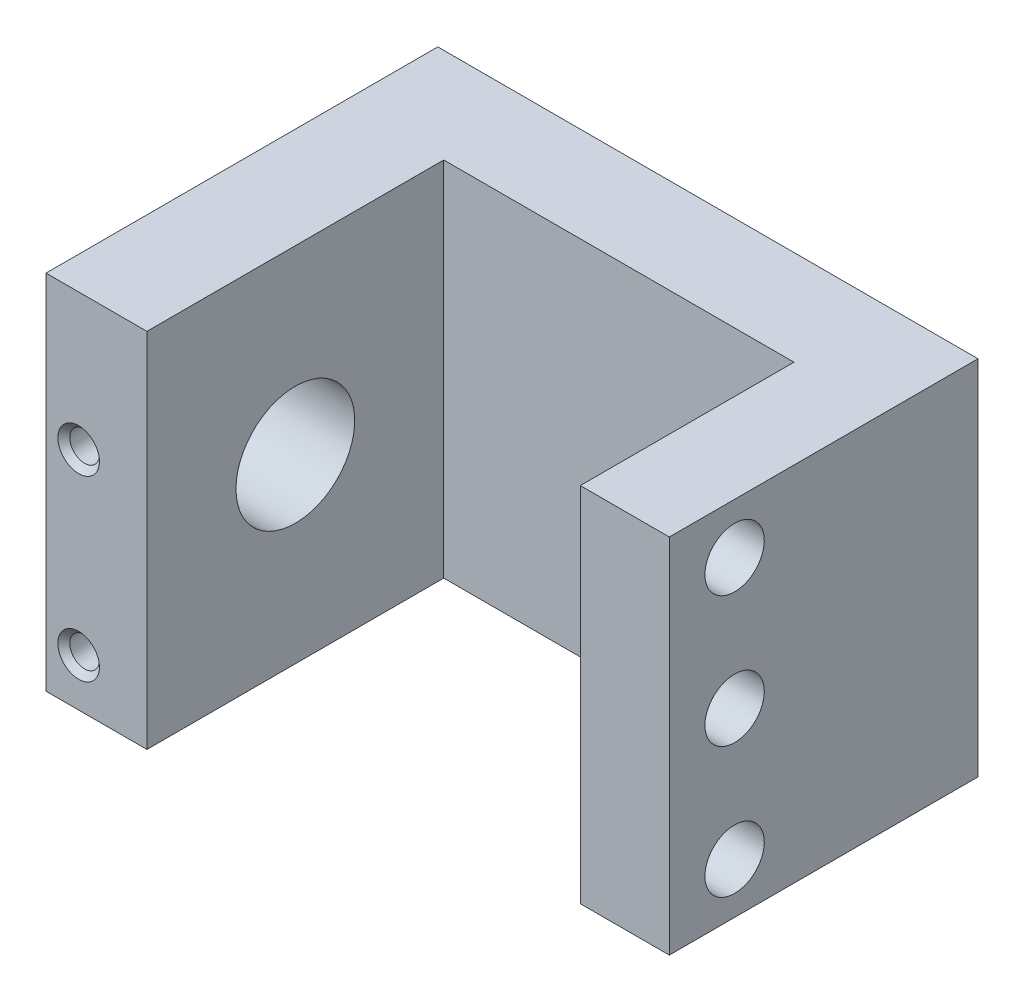
ISO-10303-21;
HEADER;
FILE_DESCRIPTION(('STEP AP214'),'2;1');
FILE_NAME('part.step','',(''),(''),'','','');
FILE_SCHEMA(('AUTOMOTIVE_DESIGN { 1 0 10303 214 1 1 1 1 }'));
ENDSEC;
DATA;
#1=APPLICATION_CONTEXT('core data for automotive mechanical design processes');
#2=APPLICATION_PROTOCOL_DEFINITION('international standard','automotive_design',2000,#1);
#3=PRODUCT_CONTEXT('',#1,'mechanical');
#4=PRODUCT('Part','Part','',(#3));
#5=PRODUCT_RELATED_PRODUCT_CATEGORY('part','',(#4));
#6=PRODUCT_DEFINITION_FORMATION('','',#4);
#7=PRODUCT_DEFINITION_CONTEXT('part definition',#1,'design');
#8=PRODUCT_DEFINITION('design','',#6,#7);
#9=PRODUCT_DEFINITION_SHAPE('','',#8);
#10=(LENGTH_UNIT() NAMED_UNIT(*) SI_UNIT(.MILLI.,.METRE.));
#11=(NAMED_UNIT(*) PLANE_ANGLE_UNIT() SI_UNIT($,.RADIAN.));
#12=(NAMED_UNIT(*) SI_UNIT($,.STERADIAN.) SOLID_ANGLE_UNIT());
#13=UNCERTAINTY_MEASURE_WITH_UNIT(LENGTH_MEASURE(1.E-05),#10,'distance_accuracy_value','');
#14=(GEOMETRIC_REPRESENTATION_CONTEXT(3) GLOBAL_UNCERTAINTY_ASSIGNED_CONTEXT((#13)) GLOBAL_UNIT_ASSIGNED_CONTEXT((#10,
#11,#12)) REPRESENTATION_CONTEXT('',''));
#15=CARTESIAN_POINT('',(0.,0.,0.));
#16=DIRECTION('',(0.,0.,1.));
#17=DIRECTION('',(1.,0.,0.));
#18=AXIS2_PLACEMENT_3D('',#15,#16,#17);
#19=CARTESIAN_POINT('',(-38.5,289.,50.999999999874));
#20=DIRECTION('',(0.,0.,1.));
#21=DIRECTION('',(1.,0.,0.));
#22=AXIS2_PLACEMENT_3D('',#19,#20,#21);
#23=CONICAL_SURFACE('',#22,2.49999999977126,1.02974425851835);
#24=CARTESIAN_POINT('',(-38.5000000002833,289.,49.4978484523472));
#25=VERTEX_POINT('',#24);
#26=VERTEX_LOOP('',#25);
#27=FACE_BOUND('',#26,.T.);
#28=CARTESIAN_POINT('',(-38.5,289.,51.));
#29=DIRECTION('',(0.,0.,1.));
#30=DIRECTION('',(1.,0.,0.));
#31=AXIS2_PLACEMENT_3D('',#28,#29,#30);
#32=CIRCLE('',#31,2.5);
#33=CARTESIAN_POINT('',(-36.,289.,51.));
#34=VERTEX_POINT('',#33);
#35=EDGE_CURVE('E91',#34,#34,#32,.T.);
#36=ORIENTED_EDGE('',*,*,#35,.T.);
#37=EDGE_LOOP('',(#36));
#38=FACE_BOUND('',#37,.T.);
#39=ADVANCED_FACE('F18',(#27,#38),#23,.F.);
#40=CARTESIAN_POINT('',(-38.5,319.,50.999999999874));
#41=DIRECTION('',(0.,0.,1.));
#42=DIRECTION('',(1.,0.,0.));
#43=AXIS2_PLACEMENT_3D('',#40,#41,#42);
#44=CONICAL_SURFACE('',#43,2.49999999977126,1.02974425851835);
#45=CARTESIAN_POINT('',(-38.5000000002833,319.,49.4978484523472));
#46=VERTEX_POINT('',#45);
#47=VERTEX_LOOP('',#46);
#48=FACE_BOUND('',#47,.T.);
#49=CARTESIAN_POINT('',(-38.5,319.,51.));
#50=DIRECTION('',(0.,0.,1.));
#51=DIRECTION('',(1.,0.,0.));
#52=AXIS2_PLACEMENT_3D('',#49,#50,#51);
#53=CIRCLE('',#52,2.5);
#54=CARTESIAN_POINT('',(-36.,319.,51.));
#55=VERTEX_POINT('',#54);
#56=EDGE_CURVE('E93',#55,#55,#53,.T.);
#57=ORIENTED_EDGE('',*,*,#56,.T.);
#58=EDGE_LOOP('',(#57));
#59=FACE_BOUND('',#58,.T.);
#60=ADVANCED_FACE('F88',(#48,#59),#44,.F.);
#61=CARTESIAN_POINT('',(-38.5,289.,66.));
#62=DIRECTION('',(0.,0.,1.));
#63=DIRECTION('',(1.,0.,0.));
#64=AXIS2_PLACEMENT_3D('',#61,#62,#63);
#65=CYLINDRICAL_SURFACE('',#64,2.5);
#66=CARTESIAN_POINT('',(-38.5,289.,64.9999999999977));
#67=DIRECTION('',(0.,0.,1.));
#68=DIRECTION('',(1.,0.,0.));
#69=AXIS2_PLACEMENT_3D('',#66,#67,#68);
#70=CIRCLE('',#69,2.49999999999864);
#71=CARTESIAN_POINT('',(-36.0000000000014,289.,64.9999999999977));
#72=VERTEX_POINT('',#71);
#73=EDGE_CURVE('E96',#72,#72,#70,.T.);
#74=ORIENTED_EDGE('',*,*,#73,.T.);
#75=EDGE_LOOP('',(#74));
#76=FACE_BOUND('',#75,.T.);
#77=ORIENTED_EDGE('',*,*,#35,.F.);
#78=EDGE_LOOP('',(#77));
#79=FACE_BOUND('',#78,.T.);
#80=ADVANCED_FACE('F276',(#76,#79),#65,.F.);
#81=CARTESIAN_POINT('',(-38.5,319.,66.));
#82=DIRECTION('',(0.,0.,1.));
#83=DIRECTION('',(1.,0.,0.));
#84=AXIS2_PLACEMENT_3D('',#81,#82,#83);
#85=CYLINDRICAL_SURFACE('',#84,2.5);
#86=CARTESIAN_POINT('',(-38.5,319.,64.9999999999977));
#87=DIRECTION('',(0.,0.,1.));
#88=DIRECTION('',(1.,0.,0.));
#89=AXIS2_PLACEMENT_3D('',#86,#87,#88);
#90=CIRCLE('',#89,2.49999999999864);
#91=CARTESIAN_POINT('',(-36.0000000000014,319.,64.9999999999977));
#92=VERTEX_POINT('',#91);
#93=EDGE_CURVE('E136',#92,#92,#90,.T.);
#94=ORIENTED_EDGE('',*,*,#93,.T.);
#95=EDGE_LOOP('',(#94));
#96=FACE_BOUND('',#95,.T.);
#97=ORIENTED_EDGE('',*,*,#56,.F.);
#98=EDGE_LOOP('',(#97));
#99=FACE_BOUND('',#98,.T.);
#100=ADVANCED_FACE('F272',(#96,#99),#85,.F.);
#101=CARTESIAN_POINT('',(-38.5,289.,66.0000000000309));
#102=DIRECTION('',(0.,0.,1.));
#103=DIRECTION('',(1.,0.,0.));
#104=AXIS2_PLACEMENT_3D('',#101,#102,#103);
#105=CONICAL_SURFACE('',#104,3.49999999997499,0.785398163369027);
#106=CARTESIAN_POINT('',(-38.5,289.,66.0000000000309));
#107=DIRECTION('',(0.,0.,1.));
#108=DIRECTION('',(1.,0.,0.));
#109=AXIS2_PLACEMENT_3D('',#106,#107,#108);
#110=CIRCLE('',#109,3.49999999997499);
#111=CARTESIAN_POINT('',(-35.000000000025,289.,66.0000000000309));
#112=VERTEX_POINT('',#111);
#113=EDGE_CURVE('E124',#112,#112,#110,.F.);
#114=ORIENTED_EDGE('',*,*,#113,.F.);
#115=EDGE_LOOP('',(#114));
#116=FACE_BOUND('',#115,.T.);
#117=ORIENTED_EDGE('',*,*,#73,.F.);
#118=EDGE_LOOP('',(#117));
#119=FACE_BOUND('',#118,.T.);
#120=ADVANCED_FACE('F268',(#116,#119),#105,.F.);
#121=CARTESIAN_POINT('',(-38.5,319.,66.0000000000309));
#122=DIRECTION('',(0.,0.,1.));
#123=DIRECTION('',(1.,0.,0.));
#124=AXIS2_PLACEMENT_3D('',#121,#122,#123);
#125=CONICAL_SURFACE('',#124,3.49999999997499,0.785398163369027);
#126=CARTESIAN_POINT('',(-38.5,319.,66.0000000000309));
#127=DIRECTION('',(0.,0.,1.));
#128=DIRECTION('',(1.,0.,0.));
#129=AXIS2_PLACEMENT_3D('',#126,#127,#128);
#130=CIRCLE('',#129,3.49999999997499);
#131=CARTESIAN_POINT('',(-35.000000000025,319.,66.0000000000309));
#132=VERTEX_POINT('',#131);
#133=EDGE_CURVE('E121',#132,#132,#130,.F.);
#134=ORIENTED_EDGE('',*,*,#133,.F.);
#135=EDGE_LOOP('',(#134));
#136=FACE_BOUND('',#135,.T.);
#137=ORIENTED_EDGE('',*,*,#93,.F.);
#138=EDGE_LOOP('',(#137));
#139=FACE_BOUND('',#138,.T.);
#140=ADVANCED_FACE('F265',(#136,#139),#125,.F.);
#141=CARTESIAN_POINT('',(17.857864376269,289.5,41.));
#142=DIRECTION('',(1.,0.,0.));
#143=DIRECTION('',(0.,1.,0.));
#144=AXIS2_PLACEMENT_3D('',#141,#142,#143);
#145=CYLINDRICAL_SURFACE('',#144,5.);
#146=CARTESIAN_POINT('',(32.,289.5,41.));
#147=DIRECTION('',(1.,0.,0.));
#148=DIRECTION('',(0.,1.,0.));
#149=AXIS2_PLACEMENT_3D('',#146,#147,#148);
#150=CIRCLE('',#149,5.);
#151=CARTESIAN_POINT('',(32.,294.5,41.));
#152=VERTEX_POINT('',#151);
#153=EDGE_CURVE('E21',#152,#152,#150,.F.);
#154=ORIENTED_EDGE('',*,*,#153,.T.);
#155=EDGE_LOOP('',(#154));
#156=FACE_BOUND('',#155,.T.);
#157=CARTESIAN_POINT('',(47.,289.5,41.));
#158=DIRECTION('',(1.,0.,0.));
#159=DIRECTION('',(0.,1.,0.));
#160=AXIS2_PLACEMENT_3D('',#157,#158,#159);
#161=CIRCLE('',#160,5.);
#162=CARTESIAN_POINT('',(47.,294.5,41.));
#163=VERTEX_POINT('',#162);
#164=EDGE_CURVE('E112',#163,#163,#161,.T.);
#165=ORIENTED_EDGE('',*,*,#164,.T.);
#166=EDGE_LOOP('',(#165));
#167=FACE_BOUND('',#166,.T.);
#168=ADVANCED_FACE('F262',(#156,#167),#145,.F.);
#169=CARTESIAN_POINT('',(17.857864376269,333.5,41.));
#170=DIRECTION('',(1.,0.,0.));
#171=DIRECTION('',(0.,1.,0.));
#172=AXIS2_PLACEMENT_3D('',#169,#170,#171);
#173=CYLINDRICAL_SURFACE('',#172,5.);
#174=CARTESIAN_POINT('',(32.,333.5,41.));
#175=DIRECTION('',(1.,0.,0.));
#176=DIRECTION('',(0.,1.,0.));
#177=AXIS2_PLACEMENT_3D('',#174,#175,#176);
#178=CIRCLE('',#177,5.);
#179=CARTESIAN_POINT('',(32.,338.5,41.));
#180=VERTEX_POINT('',#179);
#181=EDGE_CURVE('E131',#180,#180,#178,.F.);
#182=ORIENTED_EDGE('',*,*,#181,.T.);
#183=EDGE_LOOP('',(#182));
#184=FACE_BOUND('',#183,.T.);
#185=CARTESIAN_POINT('',(47.,333.5,41.));
#186=DIRECTION('',(1.,0.,0.));
#187=DIRECTION('',(0.,1.,0.));
#188=AXIS2_PLACEMENT_3D('',#185,#186,#187);
#189=CIRCLE('',#188,5.);
#190=CARTESIAN_POINT('',(47.,338.5,41.));
#191=VERTEX_POINT('',#190);
#192=EDGE_CURVE('E109',#191,#191,#189,.T.);
#193=ORIENTED_EDGE('',*,*,#192,.T.);
#194=EDGE_LOOP('',(#193));
#195=FACE_BOUND('',#194,.T.);
#196=ADVANCED_FACE('F258',(#184,#195),#173,.F.);
#197=CARTESIAN_POINT('',(17.857864376269,311.5,41.));
#198=DIRECTION('',(1.,0.,0.));
#199=DIRECTION('',(0.,1.,0.));
#200=AXIS2_PLACEMENT_3D('',#197,#198,#199);
#201=CYLINDRICAL_SURFACE('',#200,5.);
#202=CARTESIAN_POINT('',(32.,311.5,41.));
#203=DIRECTION('',(1.,0.,0.));
#204=DIRECTION('',(0.,1.,0.));
#205=AXIS2_PLACEMENT_3D('',#202,#203,#204);
#206=CIRCLE('',#205,5.);
#207=CARTESIAN_POINT('',(32.,316.5,41.));
#208=VERTEX_POINT('',#207);
#209=EDGE_CURVE('E128',#208,#208,#206,.F.);
#210=ORIENTED_EDGE('',*,*,#209,.T.);
#211=EDGE_LOOP('',(#210));
#212=FACE_BOUND('',#211,.T.);
#213=CARTESIAN_POINT('',(47.,311.5,41.));
#214=DIRECTION('',(1.,0.,0.));
#215=DIRECTION('',(0.,1.,0.));
#216=AXIS2_PLACEMENT_3D('',#213,#214,#215);
#217=CIRCLE('',#216,5.);
#218=CARTESIAN_POINT('',(47.,316.5,41.));
#219=VERTEX_POINT('',#218);
#220=EDGE_CURVE('E105',#219,#219,#217,.T.);
#221=ORIENTED_EDGE('',*,*,#220,.T.);
#222=EDGE_LOOP('',(#221));
#223=FACE_BOUND('',#222,.T.);
#224=ADVANCED_FACE('F254',(#212,#223),#201,.F.);
#225=CARTESIAN_POINT('',(32.,191.691545752936,52.));
#226=DIRECTION('',(0.,0.,-1.));
#227=DIRECTION('',(-1.,0.,0.));
#228=AXIS2_PLACEMENT_3D('',#225,#226,#227);
#229=PLANE('',#228);
#230=DIRECTION('',(0.,-1.,0.));
#231=VECTOR('',#230,1.);
#232=CARTESIAN_POINT('',(47.,342.,52.));
#233=LINE('',#232,#231);
#234=CARTESIAN_POINT('',(47.,281.,52.));
#235=VERTEX_POINT('',#234);
#236=CARTESIAN_POINT('',(47.,342.,52.));
#237=VERTEX_POINT('',#236);
#238=EDGE_CURVE('E165',#235,#237,#233,.F.);
#239=ORIENTED_EDGE('',*,*,#238,.T.);
#240=DIRECTION('',(1.,0.,0.));
#241=VECTOR('',#240,1.);
#242=CARTESIAN_POINT('',(-44.,342.,52.));
#243=LINE('',#242,#241);
#244=CARTESIAN_POINT('',(32.,342.,52.));
#245=VERTEX_POINT('',#244);
#246=EDGE_CURVE('E170',#237,#245,#243,.F.);
#247=ORIENTED_EDGE('',*,*,#246,.T.);
#248=DIRECTION('',(0.,1.,0.));
#249=VECTOR('',#248,1.);
#250=CARTESIAN_POINT('',(32.,191.691545752936,52.));
#251=LINE('',#250,#249);
#252=CARTESIAN_POINT('',(32.,281.,52.));
#253=VERTEX_POINT('',#252);
#254=EDGE_CURVE('E130',#245,#253,#251,.F.);
#255=ORIENTED_EDGE('',*,*,#254,.T.);
#256=DIRECTION('',(1.,0.,0.));
#257=VECTOR('',#256,1.);
#258=CARTESIAN_POINT('',(-44.,281.,52.));
#259=LINE('',#258,#257);
#260=EDGE_CURVE('E153',#253,#235,#259,.T.);
#261=ORIENTED_EDGE('',*,*,#260,.T.);
#262=EDGE_LOOP('',(#239,#247,#255,#261));
#263=FACE_BOUND('',#262,.T.);
#264=ADVANCED_FACE('F250',(#263),#229,.F.);
#265=CARTESIAN_POINT('',(32.,191.691545752936,16.));
#266=DIRECTION('',(1.,0.,0.));
#267=DIRECTION('',(0.,0.,-1.));
#268=AXIS2_PLACEMENT_3D('',#265,#266,#267);
#269=PLANE('',#268);
#270=ORIENTED_EDGE('',*,*,#254,.F.);
#271=DIRECTION('',(0.,0.,-1.));
#272=VECTOR('',#271,1.);
#273=CARTESIAN_POINT('',(32.,342.,66.));
#274=LINE('',#273,#272);
#275=CARTESIAN_POINT('',(32.,342.,16.));
#276=VERTEX_POINT('',#275);
#277=EDGE_CURVE('E173',#245,#276,#274,.T.);
#278=ORIENTED_EDGE('',*,*,#277,.T.);
#279=DIRECTION('',(0.,1.,0.));
#280=VECTOR('',#279,1.);
#281=CARTESIAN_POINT('',(32.,191.691545752936,16.));
#282=LINE('',#281,#280);
#283=CARTESIAN_POINT('',(32.,281.,16.));
#284=VERTEX_POINT('',#283);
#285=EDGE_CURVE('E146',#276,#284,#282,.F.);
#286=ORIENTED_EDGE('',*,*,#285,.T.);
#287=DIRECTION('',(0.,0.,1.));
#288=VECTOR('',#287,1.);
#289=CARTESIAN_POINT('',(32.,281.,66.));
#290=LINE('',#289,#288);
#291=EDGE_CURVE('E119',#284,#253,#290,.T.);
#292=ORIENTED_EDGE('',*,*,#291,.T.);
#293=EDGE_LOOP('',(#270,#278,#286,#292));
#294=FACE_BOUND('',#293,.T.);
#295=ORIENTED_EDGE('',*,*,#209,.F.);
#296=EDGE_LOOP('',(#295));
#297=FACE_BOUND('',#296,.T.);
#298=ORIENTED_EDGE('',*,*,#181,.F.);
#299=EDGE_LOOP('',(#298));
#300=FACE_BOUND('',#299,.T.);
#301=ORIENTED_EDGE('',*,*,#153,.F.);
#302=EDGE_LOOP('',(#301));
#303=FACE_BOUND('',#302,.T.);
#304=ADVANCED_FACE('F246',(#294,#297,#300,#303),#269,.F.);
#305=CARTESIAN_POINT('',(-27.,191.691545752936,16.));
#306=DIRECTION('',(0.,0.,-1.));
#307=DIRECTION('',(-1.,0.,0.));
#308=AXIS2_PLACEMENT_3D('',#305,#306,#307);
#309=PLANE('',#308);
#310=ORIENTED_EDGE('',*,*,#285,.F.);
#311=DIRECTION('',(1.,0.,0.));
#312=VECTOR('',#311,1.);
#313=CARTESIAN_POINT('',(-44.,342.,16.));
#314=LINE('',#313,#312);
#315=CARTESIAN_POINT('',(-27.,342.,16.));
#316=VERTEX_POINT('',#315);
#317=EDGE_CURVE('E176',#276,#316,#314,.F.);
#318=ORIENTED_EDGE('',*,*,#317,.T.);
#319=DIRECTION('',(0.,1.,0.));
#320=VECTOR('',#319,1.);
#321=CARTESIAN_POINT('',(-27.,191.691545752936,16.));
#322=LINE('',#321,#320);
#323=CARTESIAN_POINT('',(-27.,281.,16.));
#324=VERTEX_POINT('',#323);
#325=EDGE_CURVE('E127',#316,#324,#322,.F.);
#326=ORIENTED_EDGE('',*,*,#325,.T.);
#327=DIRECTION('',(1.,0.,0.));
#328=VECTOR('',#327,1.);
#329=CARTESIAN_POINT('',(-44.,281.,16.));
#330=LINE('',#329,#328);
#331=EDGE_CURVE('E115',#324,#284,#330,.T.);
#332=ORIENTED_EDGE('',*,*,#331,.T.);
#333=EDGE_LOOP('',(#310,#318,#326,#332));
#334=FACE_BOUND('',#333,.T.);
#335=ADVANCED_FACE('F242',(#334),#309,.F.);
#336=CARTESIAN_POINT('',(-27.,191.691545752936,66.));
#337=DIRECTION('',(-1.,0.,0.));
#338=DIRECTION('',(0.,0.,1.));
#339=AXIS2_PLACEMENT_3D('',#336,#337,#338);
#340=PLANE('',#339);
#341=CARTESIAN_POINT('',(-27.,311.5,41.));
#342=DIRECTION('',(-1.,0.,0.));
#343=DIRECTION('',(0.,0.,1.));
#344=AXIS2_PLACEMENT_3D('',#341,#342,#343);
#345=CIRCLE('',#344,9.99999999999998);
#346=CARTESIAN_POINT('',(-27.,311.5,51.));
#347=VERTEX_POINT('',#346);
#348=EDGE_CURVE('E116',#347,#347,#345,.T.);
#349=ORIENTED_EDGE('',*,*,#348,.T.);
#350=EDGE_LOOP('',(#349));
#351=FACE_BOUND('',#350,.T.);
#352=ORIENTED_EDGE('',*,*,#325,.F.);
#353=DIRECTION('',(0.,0.,-1.));
#354=VECTOR('',#353,1.);
#355=CARTESIAN_POINT('',(-27.,342.,66.));
#356=LINE('',#355,#354);
#357=CARTESIAN_POINT('',(-27.,342.,66.));
#358=VERTEX_POINT('',#357);
#359=EDGE_CURVE('E179',#316,#358,#356,.F.);
#360=ORIENTED_EDGE('',*,*,#359,.T.);
#361=DIRECTION('',(0.,1.,0.));
#362=VECTOR('',#361,1.);
#363=CARTESIAN_POINT('',(-27.,281.,66.));
#364=LINE('',#363,#362);
#365=CARTESIAN_POINT('',(-27.,281.,66.));
#366=VERTEX_POINT('',#365);
#367=EDGE_CURVE('E120',#366,#358,#364,.T.);
#368=ORIENTED_EDGE('',*,*,#367,.F.);
#369=DIRECTION('',(0.,0.,1.));
#370=VECTOR('',#369,1.);
#371=CARTESIAN_POINT('',(-27.,281.,66.));
#372=LINE('',#371,#370);
#373=EDGE_CURVE('E158',#366,#324,#372,.F.);
#374=ORIENTED_EDGE('',*,*,#373,.T.);
#375=EDGE_LOOP('',(#352,#360,#368,#374));
#376=FACE_BOUND('',#375,.T.);
#377=ADVANCED_FACE('F238',(#351,#376),#340,.F.);
#378=CARTESIAN_POINT('',(-44.,281.,66.));
#379=DIRECTION('',(0.,0.,1.));
#380=DIRECTION('',(1.,0.,0.));
#381=AXIS2_PLACEMENT_3D('',#378,#379,#380);
#382=PLANE('',#381);
#383=DIRECTION('',(0.,1.,0.));
#384=VECTOR('',#383,1.);
#385=CARTESIAN_POINT('',(-44.,342.,66.));
#386=LINE('',#385,#384);
#387=CARTESIAN_POINT('',(-44.,342.,66.));
#388=VERTEX_POINT('',#387);
#389=CARTESIAN_POINT('',(-44.,281.,66.));
#390=VERTEX_POINT('',#389);
#391=EDGE_CURVE('E185',#388,#390,#386,.F.);
#392=ORIENTED_EDGE('',*,*,#391,.T.);
#393=DIRECTION('',(1.,0.,0.));
#394=VECTOR('',#393,1.);
#395=CARTESIAN_POINT('',(-44.,281.,66.));
#396=LINE('',#395,#394);
#397=EDGE_CURVE('E155',#390,#366,#396,.T.);
#398=ORIENTED_EDGE('',*,*,#397,.T.);
#399=ORIENTED_EDGE('',*,*,#367,.T.);
#400=DIRECTION('',(1.,0.,0.));
#401=VECTOR('',#400,1.);
#402=CARTESIAN_POINT('',(-44.,342.,66.));
#403=LINE('',#402,#401);
#404=EDGE_CURVE('E182',#358,#388,#403,.F.);
#405=ORIENTED_EDGE('',*,*,#404,.T.);
#406=EDGE_LOOP('',(#392,#398,#399,#405));
#407=FACE_BOUND('',#406,.T.);
#408=ORIENTED_EDGE('',*,*,#133,.T.);
#409=EDGE_LOOP('',(#408));
#410=FACE_BOUND('',#409,.T.);
#411=ORIENTED_EDGE('',*,*,#113,.T.);
#412=EDGE_LOOP('',(#411));
#413=FACE_BOUND('',#412,.T.);
#414=ADVANCED_FACE('F234',(#407,#410,#413),#382,.T.);
#415=CARTESIAN_POINT('',(-44.,311.5,41.));
#416=DIRECTION('',(-1.,0.,0.));
#417=DIRECTION('',(0.,0.,1.));
#418=AXIS2_PLACEMENT_3D('',#415,#416,#417);
#419=CYLINDRICAL_SURFACE('',#418,9.99999999999998);
#420=ORIENTED_EDGE('',*,*,#348,.F.);
#421=EDGE_LOOP('',(#420));
#422=FACE_BOUND('',#421,.T.);
#423=CARTESIAN_POINT('',(-44.,311.5,41.));
#424=DIRECTION('',(-1.,0.,0.));
#425=DIRECTION('',(0.,0.,1.));
#426=AXIS2_PLACEMENT_3D('',#423,#424,#425);
#427=CIRCLE('',#426,9.99999999999998);
#428=CARTESIAN_POINT('',(-44.,311.5,51.));
#429=VERTEX_POINT('',#428);
#430=EDGE_CURVE('E100',#429,#429,#427,.T.);
#431=ORIENTED_EDGE('',*,*,#430,.T.);
#432=EDGE_LOOP('',(#431));
#433=FACE_BOUND('',#432,.T.);
#434=ADVANCED_FACE('F231',(#422,#433),#419,.F.);
#435=CARTESIAN_POINT('',(-44.,281.,66.));
#436=DIRECTION('',(0.,1.,0.));
#437=DIRECTION('',(0.,0.,1.));
#438=AXIS2_PLACEMENT_3D('',#435,#436,#437);
#439=PLANE('',#438);
#440=ORIENTED_EDGE('',*,*,#373,.F.);
#441=ORIENTED_EDGE('',*,*,#397,.F.);
#442=DIRECTION('',(0.,0.,1.));
#443=VECTOR('',#442,1.);
#444=CARTESIAN_POINT('',(-44.,281.,66.));
#445=LINE('',#444,#443);
#446=CARTESIAN_POINT('',(-44.,281.,0.));
#447=VERTEX_POINT('',#446);
#448=EDGE_CURVE('E104',#390,#447,#445,.F.);
#449=ORIENTED_EDGE('',*,*,#448,.T.);
#450=DIRECTION('',(1.,0.,0.));
#451=VECTOR('',#450,1.);
#452=CARTESIAN_POINT('',(-44.,281.,0.));
#453=LINE('',#452,#451);
#454=CARTESIAN_POINT('',(47.,281.,0.));
#455=VERTEX_POINT('',#454);
#456=EDGE_CURVE('E103',#447,#455,#453,.T.);
#457=ORIENTED_EDGE('',*,*,#456,.T.);
#458=DIRECTION('',(0.,0.,1.));
#459=VECTOR('',#458,1.);
#460=CARTESIAN_POINT('',(47.,281.,66.));
#461=LINE('',#460,#459);
#462=EDGE_CURVE('E108',#455,#235,#461,.T.);
#463=ORIENTED_EDGE('',*,*,#462,.T.);
#464=ORIENTED_EDGE('',*,*,#260,.F.);
#465=ORIENTED_EDGE('',*,*,#291,.F.);
#466=ORIENTED_EDGE('',*,*,#331,.F.);
#467=EDGE_LOOP('',(#440,#441,#449,#457,#463,#464,#465,#466));
#468=FACE_BOUND('',#467,.T.);
#469=ADVANCED_FACE('F212',(#468),#439,.F.);
#470=CARTESIAN_POINT('',(47.,342.,66.));
#471=DIRECTION('',(-1.,0.,0.));
#472=DIRECTION('',(0.,-1.,0.));
#473=AXIS2_PLACEMENT_3D('',#470,#471,#472);
#474=PLANE('',#473);
#475=ORIENTED_EDGE('',*,*,#238,.F.);
#476=ORIENTED_EDGE('',*,*,#462,.F.);
#477=DIRECTION('',(0.,1.,0.));
#478=VECTOR('',#477,1.);
#479=CARTESIAN_POINT('',(47.,281.,0.));
#480=LINE('',#479,#478);
#481=CARTESIAN_POINT('',(47.,342.,0.));
#482=VERTEX_POINT('',#481);
#483=EDGE_CURVE('E192',#455,#482,#480,.T.);
#484=ORIENTED_EDGE('',*,*,#483,.T.);
#485=DIRECTION('',(0.,0.,-1.));
#486=VECTOR('',#485,1.);
#487=CARTESIAN_POINT('',(47.,342.,66.));
#488=LINE('',#487,#486);
#489=EDGE_CURVE('E167',#482,#237,#488,.F.);
#490=ORIENTED_EDGE('',*,*,#489,.T.);
#491=EDGE_LOOP('',(#475,#476,#484,#490));
#492=FACE_BOUND('',#491,.T.);
#493=ORIENTED_EDGE('',*,*,#220,.F.);
#494=EDGE_LOOP('',(#493));
#495=FACE_BOUND('',#494,.T.);
#496=ORIENTED_EDGE('',*,*,#192,.F.);
#497=EDGE_LOOP('',(#496));
#498=FACE_BOUND('',#497,.T.);
#499=ORIENTED_EDGE('',*,*,#164,.F.);
#500=EDGE_LOOP('',(#499));
#501=FACE_BOUND('',#500,.T.);
#502=ADVANCED_FACE('F207',(#492,#495,#498,#501),#474,.F.);
#503=CARTESIAN_POINT('',(-44.,342.,66.));
#504=DIRECTION('',(0.,-1.,0.));
#505=DIRECTION('',(0.,0.,-1.));
#506=AXIS2_PLACEMENT_3D('',#503,#504,#505);
#507=PLANE('',#506);
#508=ORIENTED_EDGE('',*,*,#359,.F.);
#509=ORIENTED_EDGE('',*,*,#317,.F.);
#510=ORIENTED_EDGE('',*,*,#277,.F.);
#511=ORIENTED_EDGE('',*,*,#246,.F.);
#512=ORIENTED_EDGE('',*,*,#489,.F.);
#513=DIRECTION('',(1.,0.,0.));
#514=VECTOR('',#513,1.);
#515=CARTESIAN_POINT('',(-44.,342.,0.));
#516=LINE('',#515,#514);
#517=CARTESIAN_POINT('',(-44.,342.,0.));
#518=VERTEX_POINT('',#517);
#519=EDGE_CURVE('E27',#482,#518,#516,.F.);
#520=ORIENTED_EDGE('',*,*,#519,.T.);
#521=DIRECTION('',(0.,0.,1.));
#522=VECTOR('',#521,1.);
#523=CARTESIAN_POINT('',(-44.,342.,66.));
#524=LINE('',#523,#522);
#525=EDGE_CURVE('E35',#518,#388,#524,.T.);
#526=ORIENTED_EDGE('',*,*,#525,.T.);
#527=ORIENTED_EDGE('',*,*,#404,.F.);
#528=EDGE_LOOP('',(#508,#509,#510,#511,#512,#520,#526,#527));
#529=FACE_BOUND('',#528,.T.);
#530=ADVANCED_FACE('F199',(#529),#507,.F.);
#531=CARTESIAN_POINT('',(-44.,342.,66.));
#532=DIRECTION('',(1.,0.,0.));
#533=DIRECTION('',(0.,1.,0.));
#534=AXIS2_PLACEMENT_3D('',#531,#532,#533);
#535=PLANE('',#534);
#536=ORIENTED_EDGE('',*,*,#430,.F.);
#537=EDGE_LOOP('',(#536));
#538=FACE_BOUND('',#537,.T.);
#539=ORIENTED_EDGE('',*,*,#448,.F.);
#540=ORIENTED_EDGE('',*,*,#391,.F.);
#541=ORIENTED_EDGE('',*,*,#525,.F.);
#542=DIRECTION('',(0.,1.,0.));
#543=VECTOR('',#542,1.);
#544=CARTESIAN_POINT('',(-44.,281.,0.));
#545=LINE('',#544,#543);
#546=EDGE_CURVE('E11',#518,#447,#545,.F.);
#547=ORIENTED_EDGE('',*,*,#546,.T.);
#548=EDGE_LOOP('',(#539,#540,#541,#547));
#549=FACE_BOUND('',#548,.T.);
#550=ADVANCED_FACE('F214',(#538,#549),#535,.F.);
#551=CARTESIAN_POINT('',(-44.,281.,0.));
#552=DIRECTION('',(0.,0.,1.));
#553=DIRECTION('',(1.,0.,0.));
#554=AXIS2_PLACEMENT_3D('',#551,#552,#553);
#555=PLANE('',#554);
#556=ORIENTED_EDGE('',*,*,#519,.F.);
#557=ORIENTED_EDGE('',*,*,#483,.F.);
#558=ORIENTED_EDGE('',*,*,#456,.F.);
#559=ORIENTED_EDGE('',*,*,#546,.F.);
#560=EDGE_LOOP('',(#556,#557,#558,#559));
#561=FACE_BOUND('',#560,.T.);
#562=ADVANCED_FACE('F204',(#561),#555,.F.);
#563=CLOSED_SHELL('',(#39,#60,#80,#100,#120,#140,#168,#196,#224,#264,#304,#335,#377,#414,#434,
#469,#502,#530,#550,#562));
#564=MANIFOLD_SOLID_BREP('B1',#563);
#565=ADVANCED_BREP_SHAPE_REPRESENTATION('',(#18,#564),#14);
#566=SHAPE_DEFINITION_REPRESENTATION(#9,#565);
ENDSEC;
END-ISO-10303-21;
